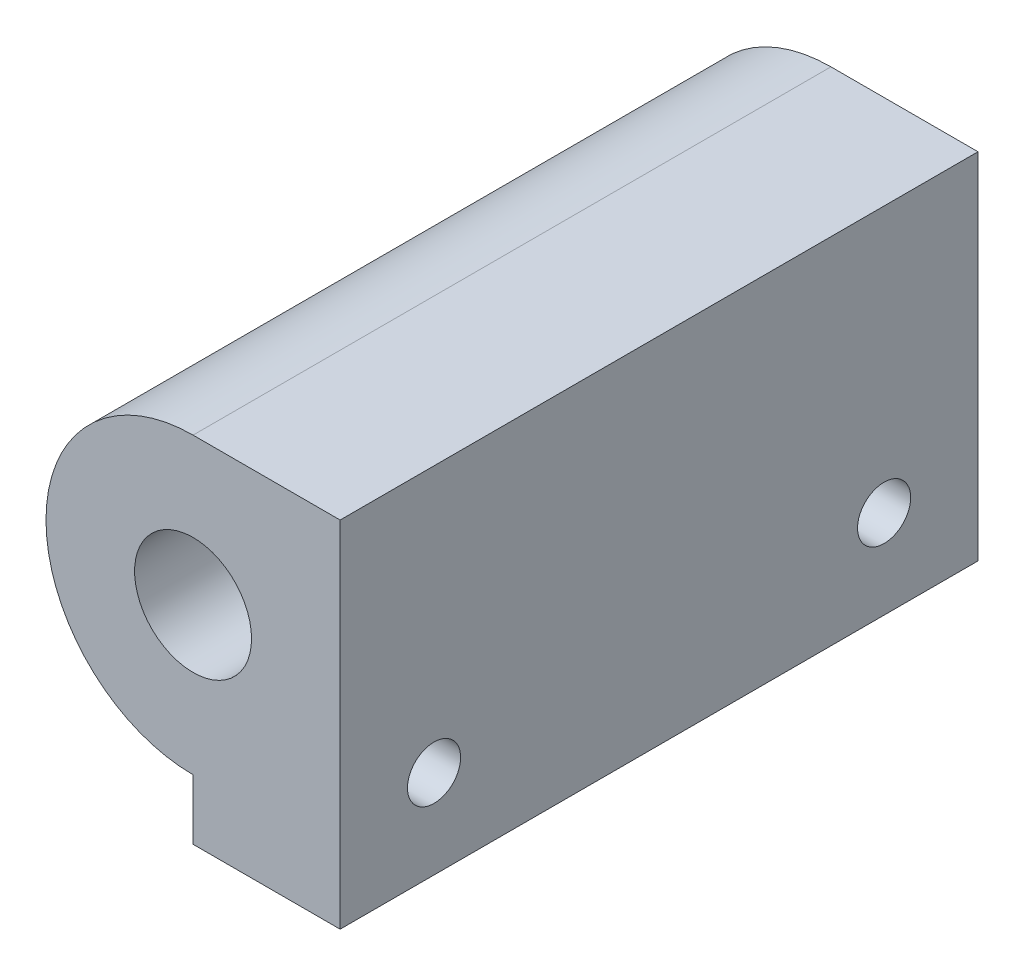
ISO-10303-21;
HEADER;
FILE_DESCRIPTION(('STEP AP214'),'2;1');
FILE_NAME('part.step','',(''),(''),'','','');
FILE_SCHEMA(('AUTOMOTIVE_DESIGN { 1 0 10303 214 1 1 1 1 }'));
ENDSEC;
DATA;
#1=APPLICATION_CONTEXT('core data for automotive mechanical design processes');
#2=APPLICATION_PROTOCOL_DEFINITION('international standard','automotive_design',2000,#1);
#3=PRODUCT_CONTEXT('',#1,'mechanical');
#4=PRODUCT('Part','Part','',(#3));
#5=PRODUCT_RELATED_PRODUCT_CATEGORY('part','',(#4));
#6=PRODUCT_DEFINITION_FORMATION('','',#4);
#7=PRODUCT_DEFINITION_CONTEXT('part definition',#1,'design');
#8=PRODUCT_DEFINITION('design','',#6,#7);
#9=PRODUCT_DEFINITION_SHAPE('','',#8);
#10=(LENGTH_UNIT() NAMED_UNIT(*) SI_UNIT(.MILLI.,.METRE.));
#11=(NAMED_UNIT(*) PLANE_ANGLE_UNIT() SI_UNIT($,.RADIAN.));
#12=(NAMED_UNIT(*) SI_UNIT($,.STERADIAN.) SOLID_ANGLE_UNIT());
#13=UNCERTAINTY_MEASURE_WITH_UNIT(LENGTH_MEASURE(1.E-05),#10,'distance_accuracy_value','');
#14=(GEOMETRIC_REPRESENTATION_CONTEXT(3) GLOBAL_UNCERTAINTY_ASSIGNED_CONTEXT((#13)) GLOBAL_UNIT_ASSIGNED_CONTEXT((#10,
#11,#12)) REPRESENTATION_CONTEXT('',''));
#15=CARTESIAN_POINT('',(0.,0.,0.));
#16=DIRECTION('',(0.,0.,1.));
#17=DIRECTION('',(1.,0.,0.));
#18=AXIS2_PLACEMENT_3D('',#15,#16,#17);
#19=CARTESIAN_POINT('',(0.,0.,9.));
#20=DIRECTION('',(0.,0.,1.));
#21=DIRECTION('',(1.,0.,0.));
#22=AXIS2_PLACEMENT_3D('',#19,#20,#21);
#23=PLANE('',#22);
#24=CARTESIAN_POINT('',(0.,0.,9.));
#25=DIRECTION('',(0.,0.,1.));
#26=DIRECTION('',(1.,0.,0.));
#27=AXIS2_PLACEMENT_3D('',#24,#25,#26);
#28=CIRCLE('',#27,4.15);
#29=CARTESIAN_POINT('',(0.,4.15,9.));
#30=VERTEX_POINT('',#29);
#31=CARTESIAN_POINT('',(0.,-4.15,9.));
#32=VERTEX_POINT('',#31);
#33=EDGE_CURVE('E118',#30,#32,#28,.T.);
#34=ORIENTED_EDGE('',*,*,#33,.T.);
#35=DIRECTION('',(0.,-1.,0.));
#36=VECTOR('',#35,1.);
#37=CARTESIAN_POINT('',(0.,-4.15,9.));
#38=LINE('',#37,#36);
#39=CARTESIAN_POINT('',(0.,-5.85,9.));
#40=VERTEX_POINT('',#39);
#41=EDGE_CURVE('E85',#32,#40,#38,.T.);
#42=ORIENTED_EDGE('',*,*,#41,.T.);
#43=DIRECTION('',(1.,0.,0.));
#44=VECTOR('',#43,1.);
#45=CARTESIAN_POINT('',(0.,-5.85,9.));
#46=LINE('',#45,#44);
#47=CARTESIAN_POINT('',(4.15,-5.85,9.));
#48=VERTEX_POINT('',#47);
#49=EDGE_CURVE('E89',#40,#48,#46,.T.);
#50=ORIENTED_EDGE('',*,*,#49,.T.);
#51=DIRECTION('',(0.,1.,0.));
#52=VECTOR('',#51,1.);
#53=CARTESIAN_POINT('',(4.15,-5.85,9.));
#54=LINE('',#53,#52);
#55=CARTESIAN_POINT('',(4.15,4.15,9.));
#56=VERTEX_POINT('',#55);
#57=EDGE_CURVE('E93',#48,#56,#54,.T.);
#58=ORIENTED_EDGE('',*,*,#57,.T.);
#59=DIRECTION('',(-1.,0.,0.));
#60=VECTOR('',#59,1.);
#61=CARTESIAN_POINT('',(4.15,4.15,9.));
#62=LINE('',#61,#60);
#63=EDGE_CURVE('E51',#56,#30,#62,.T.);
#64=ORIENTED_EDGE('',*,*,#63,.T.);
#65=EDGE_LOOP('',(#34,#42,#50,#58,#64));
#66=FACE_BOUND('',#65,.T.);
#67=CARTESIAN_POINT('',(0.,0.,9.));
#68=DIRECTION('',(0.,0.,1.));
#69=DIRECTION('',(1.,0.,0.));
#70=AXIS2_PLACEMENT_3D('',#67,#68,#69);
#71=CIRCLE('',#70,1.65);
#72=CARTESIAN_POINT('',(1.65,0.,9.));
#73=VERTEX_POINT('',#72);
#74=EDGE_CURVE('E113',#73,#73,#71,.T.);
#75=ORIENTED_EDGE('',*,*,#74,.F.);
#76=EDGE_LOOP('',(#75));
#77=FACE_BOUND('',#76,.T.);
#78=ADVANCED_FACE('F33',(#66,#77),#23,.T.);
#79=CARTESIAN_POINT('',(0.,0.,-9.));
#80=DIRECTION('',(0.,0.,1.));
#81=DIRECTION('',(1.,0.,0.));
#82=AXIS2_PLACEMENT_3D('',#79,#80,#81);
#83=PLANE('',#82);
#84=CARTESIAN_POINT('',(0.,0.,-9.));
#85=DIRECTION('',(0.,0.,1.));
#86=DIRECTION('',(1.,0.,0.));
#87=AXIS2_PLACEMENT_3D('',#84,#85,#86);
#88=CIRCLE('',#87,4.15);
#89=CARTESIAN_POINT('',(0.,4.15,-9.));
#90=VERTEX_POINT('',#89);
#91=CARTESIAN_POINT('',(0.,-4.15,-9.));
#92=VERTEX_POINT('',#91);
#93=EDGE_CURVE('E109',#90,#92,#88,.T.);
#94=ORIENTED_EDGE('',*,*,#93,.F.);
#95=DIRECTION('',(-1.,0.,0.));
#96=VECTOR('',#95,1.);
#97=CARTESIAN_POINT('',(4.15,4.15,-9.));
#98=LINE('',#97,#96);
#99=CARTESIAN_POINT('',(4.15,4.15,-9.));
#100=VERTEX_POINT('',#99);
#101=EDGE_CURVE('E77',#100,#90,#98,.T.);
#102=ORIENTED_EDGE('',*,*,#101,.F.);
#103=DIRECTION('',(0.,1.,0.));
#104=VECTOR('',#103,1.);
#105=CARTESIAN_POINT('',(4.15,-5.85,-9.));
#106=LINE('',#105,#104);
#107=CARTESIAN_POINT('',(4.15,-5.85,-9.));
#108=VERTEX_POINT('',#107);
#109=EDGE_CURVE('E71',#108,#100,#106,.T.);
#110=ORIENTED_EDGE('',*,*,#109,.F.);
#111=DIRECTION('',(1.,0.,0.));
#112=VECTOR('',#111,1.);
#113=CARTESIAN_POINT('',(0.,-5.85,-9.));
#114=LINE('',#113,#112);
#115=CARTESIAN_POINT('',(0.,-5.85,-9.));
#116=VERTEX_POINT('',#115);
#117=EDGE_CURVE('E100',#116,#108,#114,.T.);
#118=ORIENTED_EDGE('',*,*,#117,.F.);
#119=DIRECTION('',(0.,-1.,0.));
#120=VECTOR('',#119,1.);
#121=CARTESIAN_POINT('',(0.,-4.15,-9.));
#122=LINE('',#121,#120);
#123=EDGE_CURVE('E112',#92,#116,#122,.T.);
#124=ORIENTED_EDGE('',*,*,#123,.F.);
#125=EDGE_LOOP('',(#94,#102,#110,#118,#124));
#126=FACE_BOUND('',#125,.T.);
#127=CARTESIAN_POINT('',(0.,0.,-9.));
#128=DIRECTION('',(0.,0.,1.));
#129=DIRECTION('',(1.,0.,0.));
#130=AXIS2_PLACEMENT_3D('',#127,#128,#129);
#131=CIRCLE('',#130,1.65);
#132=CARTESIAN_POINT('',(1.65,0.,-9.));
#133=VERTEX_POINT('',#132);
#134=EDGE_CURVE('E170',#133,#133,#131,.T.);
#135=ORIENTED_EDGE('',*,*,#134,.T.);
#136=EDGE_LOOP('',(#135));
#137=FACE_BOUND('',#136,.T.);
#138=ADVANCED_FACE('F122',(#126,#137),#83,.F.);
#139=CARTESIAN_POINT('',(0.,0.,9.));
#140=DIRECTION('',(0.,0.,-1.));
#141=DIRECTION('',(-1.,0.,0.));
#142=AXIS2_PLACEMENT_3D('',#139,#140,#141);
#143=CYLINDRICAL_SURFACE('',#142,4.15);
#144=CARTESIAN_POINT('',(-2.44948974278318,-3.35,5.6));
#145=CARTESIAN_POINT('',(-2.52343122206385,-3.29593660031395,5.59999746942867));
#146=CARTESIAN_POINT('',(-2.59560716615755,-3.23938834132045,5.60578919743885));
#147=CARTESIAN_POINT('',(-2.73435232068845,-3.12312159664327,5.63267031478044));
#148=CARTESIAN_POINT('',(-2.80094287987506,-3.06341675186005,5.65369818695591));
#149=CARTESIAN_POINT('',(-2.89713692579164,-2.97175793802122,5.70133751223552));
#150=CARTESIAN_POINT('',(-2.92983277227072,-2.93948231337421,5.72110681452365));
#151=CARTESIAN_POINT('',(-2.99184367546275,-2.87633646676008,5.76719042637763));
#152=CARTESIAN_POINT('',(-3.02116212605836,-2.84546485315111,5.793498080212));
#153=CARTESIAN_POINT('',(-3.07103947041873,-2.79147748861172,5.84822284743359));
#154=CARTESIAN_POINT('',(-3.09224764874424,-2.76791647439239,5.8756031388966));
#155=CARTESIAN_POINT('',(-3.13095268703524,-2.72405745001184,5.9351989023861));
#156=CARTESIAN_POINT('',(-3.14845322757933,-2.70375620876228,5.96740952455513));
#157=CARTESIAN_POINT('',(-3.17675223705296,-2.67042162645601,6.03099972984364));
#158=CARTESIAN_POINT('',(-3.18816329973604,-2.65675403386292,6.06177279876657));
#159=CARTESIAN_POINT('',(-3.20743019158531,-2.63346183084668,6.12587117920833));
#160=CARTESIAN_POINT('',(-3.21528730931639,-2.62383575516915,6.1591955605575));
#161=CARTESIAN_POINT('',(-3.227163283603,-2.60921597139552,6.22765467063681));
#162=CARTESIAN_POINT('',(-3.23116733002771,-2.60424013963282,6.26279584190567));
#163=CARTESIAN_POINT('',(-3.23511226915684,-2.59933826063692,6.333655154036));
#164=CARTESIAN_POINT('',(-3.23505394643214,-2.59941123832024,6.36937318215612));
#165=CARTESIAN_POINT('',(-3.23102464807214,-2.60441695856549,6.43775144198534));
#166=CARTESIAN_POINT('',(-3.22732284379696,-2.60901537056492,6.47045312057464));
#167=CARTESIAN_POINT('',(-3.21654122773918,-2.62229572999499,6.53442868712956));
#168=CARTESIAN_POINT('',(-3.20946153060368,-2.63097753883326,6.56570262351388));
#169=CARTESIAN_POINT('',(-3.19198210771253,-2.6521578335778,6.62673530787836));
#170=CARTESIAN_POINT('',(-3.18151471650196,-2.66473385951379,6.65644744184263));
#171=CARTESIAN_POINT('',(-3.15764317093928,-2.69297808491294,6.71307684956784));
#172=CARTESIAN_POINT('',(-3.14423810139289,-2.70864724785017,6.73999324849471));
#173=CARTESIAN_POINT('',(-3.11314161599893,-2.74435240723745,6.79367496457873));
#174=CARTESIAN_POINT('',(-3.09513290942465,-2.76468439284931,6.82005809044302));
#175=CARTESIAN_POINT('',(-3.05641052520705,-2.80743489668986,6.86882264332002));
#176=CARTESIAN_POINT('',(-3.03569518767351,-2.82985469286221,6.89120159458094));
#177=CARTESIAN_POINT('',(-2.97994319463473,-2.88874549564683,6.94332165897411));
#178=CARTESIAN_POINT('',(-2.94330962289143,-2.92614586932086,6.97031502685646));
#179=CARTESIAN_POINT('',(-2.86599398366922,-3.00192225881424,7.01581141626264));
#180=CARTESIAN_POINT('',(-2.82530212818757,-3.04030045868933,7.03429327582207));
#181=CARTESIAN_POINT('',(-2.72128194633168,-3.13433177975411,7.07082390239127));
#182=CARTESIAN_POINT('',(-2.65623722024531,-3.18970614192668,7.08466235286137));
#183=CARTESIAN_POINT('',(-2.5220023254017,-3.29688274198948,7.10007860534017));
#184=CARTESIAN_POINT('',(-2.45280641609834,-3.3486798097651,7.10163901536407));
#185=CARTESIAN_POINT('',(-2.32674851018242,-3.43705440573849,7.09594707241719));
#186=CARTESIAN_POINT('',(-2.27040500660959,-3.47452120875493,7.09050401783873));
#187=CARTESIAN_POINT('',(-2.15642251759147,-3.54639027571075,7.07476586221194));
#188=CARTESIAN_POINT('',(-2.09878274846423,-3.58079061979699,7.06446774651982));
#189=CARTESIAN_POINT('',(-1.98239938567192,-3.64651540961997,7.03979304204072));
#190=CARTESIAN_POINT('',(-1.92365287689895,-3.67782978047239,7.02540365405214));
#191=CARTESIAN_POINT('',(-1.80551612262155,-3.73724261117717,6.99318326983734));
#192=CARTESIAN_POINT('',(-1.74612607227611,-3.76534201767794,6.97535329087132));
#193=CARTESIAN_POINT('',(-1.62321684381895,-3.82000863713052,6.93549700833041));
#194=CARTESIAN_POINT('',(-1.55966983307058,-3.84637302933308,6.91327914605763));
#195=CARTESIAN_POINT('',(-1.43233121804341,-3.89558600652535,6.86575809507171));
#196=CARTESIAN_POINT('',(-1.36853949730666,-3.91843262636162,6.84045319587362));
#197=CARTESIAN_POINT('',(-1.2413771668916,-3.96054796605189,6.78691120707431));
#198=CARTESIAN_POINT('',(-1.17800598770701,-3.97983300782711,6.75868846762551));
#199=CARTESIAN_POINT('',(-1.08356985364423,-4.00617597929975,6.71363850545306));
#200=CARTESIAN_POINT('',(-1.05220691357545,-4.01452340196624,6.69817588833988));
#201=CARTESIAN_POINT('',(-0.989838975030945,-4.0303537625373,6.66613233635059));
#202=CARTESIAN_POINT('',(-0.958833880757644,-4.03783693687625,6.64955170930633));
#203=CARTESIAN_POINT('',(-0.906789383208169,-4.0497795478508,6.62014403972917));
#204=CARTESIAN_POINT('',(-0.885582593118669,-4.05446718219123,6.60770595497569));
#205=CARTESIAN_POINT('',(-0.84361346326138,-4.06340698498532,6.58181712998326));
#206=CARTESIAN_POINT('',(-0.822852361613754,-4.06765804010296,6.56836394542793));
#207=CARTESIAN_POINT('',(-0.782330855757109,-4.07564514972176,6.54014052702323));
#208=CARTESIAN_POINT('',(-0.762565270926685,-4.07938409425555,6.52537853050875));
#209=CARTESIAN_POINT('',(-0.724703240842739,-4.08627769550915,6.49373818525069));
#210=CARTESIAN_POINT('',(-0.706599030164215,-4.08943514819407,6.47687065495114));
#211=CARTESIAN_POINT('',(-0.684710480315217,-4.09312932324512,6.45150361848125));
#212=CARTESIAN_POINT('',(-0.679194003215416,-4.09404727604132,6.44458301064337));
#213=CARTESIAN_POINT('',(-0.668914467388147,-4.09573926272273,6.43016271849298));
#214=CARTESIAN_POINT('',(-0.664152286767495,-4.09651312905228,6.42266237417557));
#215=CARTESIAN_POINT('',(-0.655665842445884,-4.0978800829948,6.40690976272135));
#216=CARTESIAN_POINT('',(-0.651958731924025,-4.09847019620049,6.39864767723771));
#217=CARTESIAN_POINT('',(-0.646189448659516,-4.09938387061317,6.38155956669553));
#218=CARTESIAN_POINT('',(-0.644120609390134,-4.09970851226697,6.3727359866499));
#219=CARTESIAN_POINT('',(-0.642281521760349,-4.09999695098521,6.35706899291204));
#220=CARTESIAN_POINT('',(-0.64206769397036,-4.10003039178843,6.35027863966541));
#221=CARTESIAN_POINT('',(-0.642812869114294,-4.09991362894346,6.33676239893693));
#222=CARTESIAN_POINT('',(-0.64377252153388,-4.09976332359736,6.33003654923304));
#223=CARTESIAN_POINT('',(-0.647094318840628,-4.09924044978622,6.31528141735955));
#224=CARTESIAN_POINT('',(-0.649733014502407,-4.09882395618041,6.30731718913561));
#225=CARTESIAN_POINT('',(-0.656235341420141,-4.09778794469016,6.29192160946295));
#226=CARTESIAN_POINT('',(-0.660101929629371,-4.09716793658916,6.28449159801881));
#227=CARTESIAN_POINT('',(-0.672010695081479,-4.09523623665373,6.26463954957736));
#228=CARTESIAN_POINT('',(-0.680970999380265,-4.09376022835878,6.2527954566248));
#229=CARTESIAN_POINT('',(-0.70034090254565,-4.0904915667484,6.23041753516032));
#230=CARTESIAN_POINT('',(-0.710755776425359,-4.08869775425148,6.21988875245664));
#231=CARTESIAN_POINT('',(-0.74109001549379,-4.0833410325798,6.19171658307992));
#232=CARTESIAN_POINT('',(-0.761935612795578,-4.07951270766768,6.17513602031386));
#233=CARTESIAN_POINT('',(-0.804839931554315,-4.07126728143743,6.14376372543542));
#234=CARTESIAN_POINT('',(-0.826901847096343,-4.0668485818521,6.1289770647735));
#235=CARTESIAN_POINT('',(-0.871816129241676,-4.0574579883218,6.10054360536219));
#236=CARTESIAN_POINT('',(-0.894672307855853,-4.05248306302808,6.08690384077216));
#237=CARTESIAN_POINT('',(-0.940747820345933,-4.0420356348797,6.06054063856686));
#238=CARTESIAN_POINT('',(-0.963966653563796,-4.03656377510435,6.04781605380491));
#239=CARTESIAN_POINT('',(-1.02578735991133,-4.02142109530244,6.01503683396525));
#240=CARTESIAN_POINT('',(-1.06460274875312,-4.01132799083689,5.99557855252238));
#241=CARTESIAN_POINT('',(-1.14256180520273,-3.98982346590886,5.95809384836561));
#242=CARTESIAN_POINT('',(-1.18170556404535,-3.97841166699452,5.94006783921662));
#243=CARTESIAN_POINT('',(-1.29945721668832,-3.9421638275787,5.88777754375848));
#244=CARTESIAN_POINT('',(-1.37828517479198,-3.91533964330071,5.85535217120073));
#245=CARTESIAN_POINT('',(-1.53539811091308,-3.85643298159655,5.79521773686373));
#246=CARTESIAN_POINT('',(-1.61368402089443,-3.82437000762717,5.76749193087935));
#247=CARTESIAN_POINT('',(-1.76942183033298,-3.75485124612192,5.71720152784886));
#248=CARTESIAN_POINT('',(-1.84687455964081,-3.71740148870781,5.69463123173422));
#249=CARTESIAN_POINT('',(-2.01380938087046,-3.63007042834357,5.65228310144667));
#250=CARTESIAN_POINT('',(-2.10305754277822,-3.57915919385294,5.63366166227553));
#251=CARTESIAN_POINT('',(-2.27879754480828,-3.46990783456236,5.60751956575151));
#252=CARTESIAN_POINT('',(-2.36528838753084,-3.41156505884654,5.60000288170507));
#253=CARTESIAN_POINT('',(-2.44948974278318,-3.35,5.6));
#254=B_SPLINE_CURVE_WITH_KNOTS('',3,(#144,#145,#146,#147,#148,#149,#150,#151,#152,#153,#154,
#155,#156,#157,#158,#159,#160,#161,#162,#163,#164,#165,#166,#167,#168,#169,#170,#171,#172,#173,
#174,#175,#176,#177,#178,#179,#180,#181,#182,#183,#184,#185,#186,#187,#188,#189,#190,#191,#192,
#193,#194,#195,#196,#197,#198,#199,#200,#201,#202,#203,#204,#205,#206,#207,#208,#209,#210,#211,
#212,#213,#214,#215,#216,#217,#218,#219,#220,#221,#222,#223,#224,#225,#226,#227,#228,#229,#230,
#231,#232,#233,#234,#235,#236,#237,#238,#239,#240,#241,#242,#243,#244,#245,#246,#247,#248,#249,
#250,#251,#252,#253),.UNSPECIFIED.,.T.,.F.,(4,2,2,2,2,2,2,2,2,2,2,2,2,2,2,2,2,2,2,2,2,2,2,2,2,2,
2,2,2,2,2,2,2,2,2,2,2,2,2,2,2,2,2,2,2,2,2,2,2,2,2,2,2,2,4),(0.,0.274556543716564,
0.548010677031381,0.697615842351792,0.847069336038143,0.972245776227143,1.09729736517205,
1.20350040101851,1.3096648995725,1.41623585388968,1.52278622607009,1.6220139559011,
1.72123831814069,1.82258144699132,1.92395619293095,2.03712963481843,2.150372811017,
2.32607854888931,2.50221881222103,2.76039103475375,3.01892889547571,3.22230381620315,
3.42580518478555,3.62995033059442,3.83403521018231,4.05076564664347,4.26761672060589,
4.48344791921148,4.59127790711428,4.69907832549394,4.77414608879031,4.84940076462727,
4.92421151749257,4.99865259220138,5.02530820489699,5.05199462394208,5.07909291167778,
5.10608035492782,5.12635854868768,5.1466479708937,5.17170459380891,5.19682202041155,
5.24134412256051,5.28603209274775,5.36654417697053,5.44727881594985,5.52847712863427,
5.60957182108953,5.74324349937861,5.87695363580185,6.14471849338705,6.41150830097412,
6.67800174756909,6.99054305149673,7.30319615634713),.UNSPECIFIED.);
#255=CARTESIAN_POINT('',(-2.44948974278318,-3.35,5.6));
#256=VERTEX_POINT('',#255);
#257=EDGE_CURVE('E161',#256,#256,#254,.T.);
#258=ORIENTED_EDGE('',*,*,#257,.T.);
#259=EDGE_LOOP('',(#258));
#260=FACE_BOUND('',#259,.T.);
#261=CARTESIAN_POINT('',(-2.44948974278318,-3.35,-7.1));
#262=CARTESIAN_POINT('',(-2.52343122206385,-3.29593660031395,-7.10000253057133));
#263=CARTESIAN_POINT('',(-2.59560716615755,-3.23938834132045,-7.09421080256115));
#264=CARTESIAN_POINT('',(-2.73435232068845,-3.12312159664327,-7.06732968521956));
#265=CARTESIAN_POINT('',(-2.80094287987506,-3.06341675186005,-7.04630181304409));
#266=CARTESIAN_POINT('',(-2.89713692579164,-2.97175793802122,-6.99866248776448));
#267=CARTESIAN_POINT('',(-2.92983277227072,-2.93948231337421,-6.97889318547635));
#268=CARTESIAN_POINT('',(-2.99184367546275,-2.87633646676008,-6.93280957362238));
#269=CARTESIAN_POINT('',(-3.02116212605836,-2.84546485315111,-6.906501919788));
#270=CARTESIAN_POINT('',(-3.07103947041873,-2.79147748861172,-6.85177715256641));
#271=CARTESIAN_POINT('',(-3.09224764874424,-2.76791647439239,-6.8243968611034));
#272=CARTESIAN_POINT('',(-3.13095268703524,-2.72405745001184,-6.7648010976139));
#273=CARTESIAN_POINT('',(-3.14845322757933,-2.70375620876228,-6.73259047544487));
#274=CARTESIAN_POINT('',(-3.17675223705296,-2.67042162645601,-6.66900027015636));
#275=CARTESIAN_POINT('',(-3.18816329973604,-2.65675403386292,-6.63822720123343));
#276=CARTESIAN_POINT('',(-3.20743019158531,-2.63346183084668,-6.57412882079167));
#277=CARTESIAN_POINT('',(-3.21528730931639,-2.62383575516915,-6.5408044394425));
#278=CARTESIAN_POINT('',(-3.227163283603,-2.60921597139552,-6.47234532936319));
#279=CARTESIAN_POINT('',(-3.23116733002771,-2.60424013963282,-6.43720415809433));
#280=CARTESIAN_POINT('',(-3.23511226915684,-2.59933826063692,-6.36634484596399));
#281=CARTESIAN_POINT('',(-3.23505394643214,-2.59941123832024,-6.33062681784388));
#282=CARTESIAN_POINT('',(-3.23102464807214,-2.60441695856549,-6.26224855801466));
#283=CARTESIAN_POINT('',(-3.22732284379696,-2.60901537056492,-6.22954687942536));
#284=CARTESIAN_POINT('',(-3.21654122773918,-2.62229572999499,-6.16557131287045));
#285=CARTESIAN_POINT('',(-3.20946153060368,-2.63097753883326,-6.13429737648612));
#286=CARTESIAN_POINT('',(-3.19198210771253,-2.6521578335778,-6.07326469212164));
#287=CARTESIAN_POINT('',(-3.18151471650196,-2.66473385951379,-6.04355255815737));
#288=CARTESIAN_POINT('',(-3.15764317093928,-2.69297808491294,-5.98692315043216));
#289=CARTESIAN_POINT('',(-3.14423810139289,-2.70864724785017,-5.96000675150529));
#290=CARTESIAN_POINT('',(-3.11314161599893,-2.74435240723745,-5.90632503542127));
#291=CARTESIAN_POINT('',(-3.09513290942465,-2.76468439284931,-5.87994190955698));
#292=CARTESIAN_POINT('',(-3.05641052520705,-2.80743489668986,-5.83117735667998));
#293=CARTESIAN_POINT('',(-3.03569518767351,-2.82985469286221,-5.80879840541906));
#294=CARTESIAN_POINT('',(-2.97994319463473,-2.88874549564683,-5.75667834102589));
#295=CARTESIAN_POINT('',(-2.94330962289143,-2.92614586932086,-5.72968497314354));
#296=CARTESIAN_POINT('',(-2.86599398366922,-3.00192225881424,-5.68418858373736));
#297=CARTESIAN_POINT('',(-2.82530212818757,-3.04030045868933,-5.66570672417793));
#298=CARTESIAN_POINT('',(-2.72128194633168,-3.13433177975411,-5.62917609760873));
#299=CARTESIAN_POINT('',(-2.65623722024531,-3.18970614192668,-5.61533764713863));
#300=CARTESIAN_POINT('',(-2.5220023254017,-3.29688274198948,-5.59992139465983));
#301=CARTESIAN_POINT('',(-2.45280641609834,-3.3486798097651,-5.59836098463593));
#302=CARTESIAN_POINT('',(-2.32674851018242,-3.43705440573849,-5.60405292758281));
#303=CARTESIAN_POINT('',(-2.27040500660959,-3.47452120875493,-5.60949598216127));
#304=CARTESIAN_POINT('',(-2.15642251759147,-3.54639027571075,-5.62523413778806));
#305=CARTESIAN_POINT('',(-2.09878274846423,-3.58079061979699,-5.63553225348018));
#306=CARTESIAN_POINT('',(-1.98239938567192,-3.64651540961997,-5.66020695795928));
#307=CARTESIAN_POINT('',(-1.92365287689895,-3.67782978047239,-5.67459634594786));
#308=CARTESIAN_POINT('',(-1.80551612262155,-3.73724261117717,-5.70681673016265));
#309=CARTESIAN_POINT('',(-1.74612607227611,-3.76534201767794,-5.72464670912867));
#310=CARTESIAN_POINT('',(-1.62321684381895,-3.82000863713052,-5.76450299166959));
#311=CARTESIAN_POINT('',(-1.55966983307058,-3.84637302933308,-5.78672085394237));
#312=CARTESIAN_POINT('',(-1.43233121804341,-3.89558600652535,-5.83424190492829));
#313=CARTESIAN_POINT('',(-1.36853949730666,-3.91843262636162,-5.85954680412638));
#314=CARTESIAN_POINT('',(-1.2413771668916,-3.96054796605189,-5.91308879292569));
#315=CARTESIAN_POINT('',(-1.17800598770701,-3.97983300782711,-5.94131153237449));
#316=CARTESIAN_POINT('',(-1.08356985364422,-4.00617597929975,-5.98636149454694));
#317=CARTESIAN_POINT('',(-1.05220691357545,-4.01452340196624,-6.00182411166012));
#318=CARTESIAN_POINT('',(-0.989838975030945,-4.0303537625373,-6.03386766364941));
#319=CARTESIAN_POINT('',(-0.958833880757643,-4.03783693687625,-6.05044829069367));
#320=CARTESIAN_POINT('',(-0.906789383208169,-4.0497795478508,-6.07985596027083));
#321=CARTESIAN_POINT('',(-0.885582593118669,-4.05446718219123,-6.09229404502431));
#322=CARTESIAN_POINT('',(-0.84361346326138,-4.06340698498532,-6.11818287001674));
#323=CARTESIAN_POINT('',(-0.822852361613754,-4.06765804010296,-6.13163605457207));
#324=CARTESIAN_POINT('',(-0.782330855757109,-4.07564514972176,-6.15985947297677));
#325=CARTESIAN_POINT('',(-0.762565270926685,-4.07938409425555,-6.17462146949125));
#326=CARTESIAN_POINT('',(-0.724703240842739,-4.08627769550915,-6.20626181474931));
#327=CARTESIAN_POINT('',(-0.706599030164215,-4.08943514819407,-6.22312934504886));
#328=CARTESIAN_POINT('',(-0.684710480315217,-4.09312932324512,-6.24849638151875));
#329=CARTESIAN_POINT('',(-0.679194003215416,-4.09404727604132,-6.25541698935663));
#330=CARTESIAN_POINT('',(-0.668914467388147,-4.09573926272273,-6.26983728150702));
#331=CARTESIAN_POINT('',(-0.664152286767495,-4.09651312905228,-6.27733762582443));
#332=CARTESIAN_POINT('',(-0.655665842445884,-4.0978800829948,-6.29309023727865));
#333=CARTESIAN_POINT('',(-0.651958731924025,-4.09847019620049,-6.30135232276229));
#334=CARTESIAN_POINT('',(-0.646189448659515,-4.09938387061317,-6.31844043330447));
#335=CARTESIAN_POINT('',(-0.644120609390134,-4.09970851226697,-6.3272640133501));
#336=CARTESIAN_POINT('',(-0.642281521760349,-4.09999695098521,-6.34293100708796));
#337=CARTESIAN_POINT('',(-0.64206769397036,-4.10003039178843,-6.34972136033459));
#338=CARTESIAN_POINT('',(-0.642812869114294,-4.09991362894346,-6.36323760106307));
#339=CARTESIAN_POINT('',(-0.64377252153388,-4.09976332359736,-6.36996345076696));
#340=CARTESIAN_POINT('',(-0.647094318840628,-4.09924044978622,-6.38471858264045));
#341=CARTESIAN_POINT('',(-0.649733014502407,-4.09882395618041,-6.39268281086439));
#342=CARTESIAN_POINT('',(-0.656235341420141,-4.09778794469016,-6.40807839053705));
#343=CARTESIAN_POINT('',(-0.660101929629371,-4.09716793658916,-6.41550840198119));
#344=CARTESIAN_POINT('',(-0.672010695081479,-4.09523623665373,-6.43536045042263));
#345=CARTESIAN_POINT('',(-0.680970999380265,-4.09376022835878,-6.4472045433752));
#346=CARTESIAN_POINT('',(-0.70034090254565,-4.0904915667484,-6.46958246483968));
#347=CARTESIAN_POINT('',(-0.710755776425359,-4.08869775425148,-6.48011124754336));
#348=CARTESIAN_POINT('',(-0.74109001549379,-4.0833410325798,-6.50828341692008));
#349=CARTESIAN_POINT('',(-0.761935612795578,-4.07951270766768,-6.52486397968614));
#350=CARTESIAN_POINT('',(-0.804839931554315,-4.07126728143743,-6.55623627456458));
#351=CARTESIAN_POINT('',(-0.826901847096343,-4.0668485818521,-6.5710229352265));
#352=CARTESIAN_POINT('',(-0.871816129241676,-4.0574579883218,-6.59945639463781));
#353=CARTESIAN_POINT('',(-0.894672307855853,-4.05248306302808,-6.61309615922784));
#354=CARTESIAN_POINT('',(-0.940747820345933,-4.0420356348797,-6.63945936143314));
#355=CARTESIAN_POINT('',(-0.963966653563796,-4.03656377510435,-6.65218394619509));
#356=CARTESIAN_POINT('',(-1.02578735991133,-4.02142109530244,-6.68496316603475));
#357=CARTESIAN_POINT('',(-1.06460274875312,-4.01132799083689,-6.70442144747762));
#358=CARTESIAN_POINT('',(-1.14256180520273,-3.98982346590886,-6.74190615163438));
#359=CARTESIAN_POINT('',(-1.18170556404535,-3.97841166699452,-6.75993216078338));
#360=CARTESIAN_POINT('',(-1.29945721668832,-3.9421638275787,-6.81222245624152));
#361=CARTESIAN_POINT('',(-1.37828517479198,-3.91533964330071,-6.84464782879927));
#362=CARTESIAN_POINT('',(-1.53539811091308,-3.85643298159655,-6.90478226313627));
#363=CARTESIAN_POINT('',(-1.61368402089443,-3.82437000762717,-6.93250806912064));
#364=CARTESIAN_POINT('',(-1.76942183033298,-3.75485124612192,-6.98279847215114));
#365=CARTESIAN_POINT('',(-1.84687455964081,-3.71740148870781,-7.00536876826577));
#366=CARTESIAN_POINT('',(-2.01380938087046,-3.63007042834357,-7.04771689855333));
#367=CARTESIAN_POINT('',(-2.10305754277822,-3.57915919385294,-7.06633833772447));
#368=CARTESIAN_POINT('',(-2.27879754480828,-3.46990783456236,-7.09248043424849));
#369=CARTESIAN_POINT('',(-2.36528838753084,-3.41156505884654,-7.09999711829493));
#370=CARTESIAN_POINT('',(-2.44948974278318,-3.35,-7.1));
#371=B_SPLINE_CURVE_WITH_KNOTS('',3,(#261,#262,#263,#264,#265,#266,#267,#268,#269,#270,#271,
#272,#273,#274,#275,#276,#277,#278,#279,#280,#281,#282,#283,#284,#285,#286,#287,#288,#289,#290,
#291,#292,#293,#294,#295,#296,#297,#298,#299,#300,#301,#302,#303,#304,#305,#306,#307,#308,#309,
#310,#311,#312,#313,#314,#315,#316,#317,#318,#319,#320,#321,#322,#323,#324,#325,#326,#327,#328,
#329,#330,#331,#332,#333,#334,#335,#336,#337,#338,#339,#340,#341,#342,#343,#344,#345,#346,#347,
#348,#349,#350,#351,#352,#353,#354,#355,#356,#357,#358,#359,#360,#361,#362,#363,#364,#365,#366,
#367,#368,#369,#370),.UNSPECIFIED.,.T.,.F.,(4,2,2,2,2,2,2,2,2,2,2,2,2,2,2,2,2,2,2,2,2,2,2,2,2,2,
2,2,2,2,2,2,2,2,2,2,2,2,2,2,2,2,2,2,2,2,2,2,2,2,2,2,2,2,4),(0.,0.274556543716564,
0.548010677031381,0.69761584235179,0.847069336038143,0.972245776227143,1.09729736517205,
1.20350040101851,1.3096648995725,1.41623585388968,1.52278622607009,1.6220139559011,
1.72123831814069,1.82258144699132,1.92395619293095,2.03712963481843,2.150372811017,
2.32607854888931,2.50221881222103,2.76039103475375,3.01892889547571,3.22230381620315,
3.42580518478555,3.62995033059442,3.83403521018231,4.05076564664347,4.26761672060589,
4.48344791921148,4.59127790711428,4.69907832549394,4.77414608879031,4.84940076462727,
4.92421151749257,4.99865259220138,5.02530820489699,5.05199462394208,5.07909291167778,
5.10608035492782,5.12635854868768,5.1466479708937,5.17170459380891,5.19682202041155,
5.24134412256051,5.28603209274775,5.36654417697053,5.44727881594984,5.52847712863426,
5.60957182108953,5.74324349937861,5.87695363580184,6.14471849338705,6.41150830097412,
6.67800174756909,6.99054305149673,7.30319615634713),.UNSPECIFIED.);
#372=CARTESIAN_POINT('',(-2.44948974278318,-3.35,-7.1));
#373=VERTEX_POINT('',#372);
#374=EDGE_CURVE('E154',#373,#373,#371,.T.);
#375=ORIENTED_EDGE('',*,*,#374,.T.);
#376=EDGE_LOOP('',(#375));
#377=FACE_BOUND('',#376,.T.);
#378=ORIENTED_EDGE('',*,*,#93,.T.);
#379=DIRECTION('',(0.,0.,-1.));
#380=VECTOR('',#379,1.);
#381=CARTESIAN_POINT('',(0.,-4.15,9.));
#382=LINE('',#381,#380);
#383=EDGE_CURVE('E11',#32,#92,#382,.T.);
#384=ORIENTED_EDGE('',*,*,#383,.F.);
#385=ORIENTED_EDGE('',*,*,#33,.F.);
#386=DIRECTION('',(0.,0.,-1.));
#387=VECTOR('',#386,1.);
#388=CARTESIAN_POINT('',(0.,4.15,9.));
#389=LINE('',#388,#387);
#390=EDGE_CURVE('E105',#30,#90,#389,.T.);
#391=ORIENTED_EDGE('',*,*,#390,.T.);
#392=EDGE_LOOP('',(#378,#384,#385,#391));
#393=FACE_BOUND('',#392,.T.);
#394=ADVANCED_FACE('F35',(#260,#377,#393),#143,.T.);
#395=CARTESIAN_POINT('',(0.,-4.15,9.));
#396=DIRECTION('',(1.,0.,0.));
#397=DIRECTION('',(0.,0.,-1.));
#398=AXIS2_PLACEMENT_3D('',#395,#396,#397);
#399=PLANE('',#398);
#400=ORIENTED_EDGE('',*,*,#123,.T.);
#401=DIRECTION('',(0.,0.,-1.));
#402=VECTOR('',#401,1.);
#403=CARTESIAN_POINT('',(0.,-5.85,9.));
#404=LINE('',#403,#402);
#405=EDGE_CURVE('E43',#40,#116,#404,.T.);
#406=ORIENTED_EDGE('',*,*,#405,.F.);
#407=ORIENTED_EDGE('',*,*,#41,.F.);
#408=ORIENTED_EDGE('',*,*,#383,.T.);
#409=EDGE_LOOP('',(#400,#406,#407,#408));
#410=FACE_BOUND('',#409,.T.);
#411=ADVANCED_FACE('F194',(#410),#399,.F.);
#412=CARTESIAN_POINT('',(0.,-5.85,9.));
#413=DIRECTION('',(0.,1.,0.));
#414=DIRECTION('',(0.,0.,1.));
#415=AXIS2_PLACEMENT_3D('',#412,#413,#414);
#416=PLANE('',#415);
#417=ORIENTED_EDGE('',*,*,#117,.T.);
#418=DIRECTION('',(0.,0.,-1.));
#419=VECTOR('',#418,1.);
#420=CARTESIAN_POINT('',(4.15,-5.85,9.));
#421=LINE('',#420,#419);
#422=EDGE_CURVE('E97',#48,#108,#421,.T.);
#423=ORIENTED_EDGE('',*,*,#422,.F.);
#424=ORIENTED_EDGE('',*,*,#49,.F.);
#425=ORIENTED_EDGE('',*,*,#405,.T.);
#426=EDGE_LOOP('',(#417,#423,#424,#425));
#427=FACE_BOUND('',#426,.T.);
#428=ADVANCED_FACE('F98',(#427),#416,.F.);
#429=CARTESIAN_POINT('',(4.15,-5.85,9.));
#430=DIRECTION('',(-1.,0.,0.));
#431=DIRECTION('',(0.,0.,1.));
#432=AXIS2_PLACEMENT_3D('',#429,#430,#431);
#433=PLANE('',#432);
#434=CARTESIAN_POINT('',(4.15,-3.35,6.35));
#435=DIRECTION('',(1.,0.,0.));
#436=DIRECTION('',(0.,0.,-1.));
#437=AXIS2_PLACEMENT_3D('',#434,#435,#436);
#438=CIRCLE('',#437,0.75);
#439=CARTESIAN_POINT('',(4.15,-3.35,5.6));
#440=VERTEX_POINT('',#439);
#441=EDGE_CURVE('E162',#440,#440,#438,.T.);
#442=ORIENTED_EDGE('',*,*,#441,.F.);
#443=EDGE_LOOP('',(#442));
#444=FACE_BOUND('',#443,.T.);
#445=CARTESIAN_POINT('',(4.15,-3.35,-6.35));
#446=DIRECTION('',(1.,0.,0.));
#447=DIRECTION('',(0.,0.,-1.));
#448=AXIS2_PLACEMENT_3D('',#445,#446,#447);
#449=CIRCLE('',#448,0.75);
#450=CARTESIAN_POINT('',(4.15,-3.35,-7.1));
#451=VERTEX_POINT('',#450);
#452=EDGE_CURVE('E163',#451,#451,#449,.T.);
#453=ORIENTED_EDGE('',*,*,#452,.F.);
#454=EDGE_LOOP('',(#453));
#455=FACE_BOUND('',#454,.T.);
#456=ORIENTED_EDGE('',*,*,#109,.T.);
#457=DIRECTION('',(0.,0.,-1.));
#458=VECTOR('',#457,1.);
#459=CARTESIAN_POINT('',(4.15,4.15,9.));
#460=LINE('',#459,#458);
#461=EDGE_CURVE('E101',#56,#100,#460,.T.);
#462=ORIENTED_EDGE('',*,*,#461,.F.);
#463=ORIENTED_EDGE('',*,*,#57,.F.);
#464=ORIENTED_EDGE('',*,*,#422,.T.);
#465=EDGE_LOOP('',(#456,#462,#463,#464));
#466=FACE_BOUND('',#465,.T.);
#467=ADVANCED_FACE('F103',(#444,#455,#466),#433,.F.);
#468=CARTESIAN_POINT('',(4.15,4.15,9.));
#469=DIRECTION('',(0.,-1.,0.));
#470=DIRECTION('',(1.,0.,0.));
#471=AXIS2_PLACEMENT_3D('',#468,#469,#470);
#472=PLANE('',#471);
#473=ORIENTED_EDGE('',*,*,#101,.T.);
#474=ORIENTED_EDGE('',*,*,#390,.F.);
#475=ORIENTED_EDGE('',*,*,#63,.F.);
#476=ORIENTED_EDGE('',*,*,#461,.T.);
#477=EDGE_LOOP('',(#473,#474,#475,#476));
#478=FACE_BOUND('',#477,.T.);
#479=ADVANCED_FACE('F127',(#478),#472,.F.);
#480=CARTESIAN_POINT('',(0.,0.,9.));
#481=DIRECTION('',(0.,0.,-1.));
#482=DIRECTION('',(-1.,0.,0.));
#483=AXIS2_PLACEMENT_3D('',#480,#481,#482);
#484=CYLINDRICAL_SURFACE('',#483,1.65);
#485=ORIENTED_EDGE('',*,*,#74,.T.);
#486=EDGE_LOOP('',(#485));
#487=FACE_BOUND('',#486,.T.);
#488=ORIENTED_EDGE('',*,*,#134,.F.);
#489=EDGE_LOOP('',(#488));
#490=FACE_BOUND('',#489,.T.);
#491=ADVANCED_FACE('F129',(#487,#490),#484,.F.);
#492=CARTESIAN_POINT('',(-4.15,-3.35,-6.35));
#493=DIRECTION('',(1.,0.,0.));
#494=DIRECTION('',(0.,0.,-1.));
#495=AXIS2_PLACEMENT_3D('',#492,#493,#494);
#496=CYLINDRICAL_SURFACE('',#495,0.75);
#497=ORIENTED_EDGE('',*,*,#452,.T.);
#498=EDGE_LOOP('',(#497));
#499=FACE_BOUND('',#498,.T.);
#500=ORIENTED_EDGE('',*,*,#374,.F.);
#501=EDGE_LOOP('',(#500));
#502=FACE_BOUND('',#501,.T.);
#503=ADVANCED_FACE('F135',(#499,#502),#496,.F.);
#504=CARTESIAN_POINT('',(-4.15,-3.35,6.35));
#505=DIRECTION('',(1.,0.,0.));
#506=DIRECTION('',(0.,0.,-1.));
#507=AXIS2_PLACEMENT_3D('',#504,#505,#506);
#508=CYLINDRICAL_SURFACE('',#507,0.75);
#509=ORIENTED_EDGE('',*,*,#441,.T.);
#510=EDGE_LOOP('',(#509));
#511=FACE_BOUND('',#510,.T.);
#512=ORIENTED_EDGE('',*,*,#257,.F.);
#513=EDGE_LOOP('',(#512));
#514=FACE_BOUND('',#513,.T.);
#515=ADVANCED_FACE('F150',(#511,#514),#508,.F.);
#516=CLOSED_SHELL('',(#78,#138,#394,#411,#428,#467,#479,#491,#503,#515));
#517=MANIFOLD_SOLID_BREP('B2',#516);
#518=ADVANCED_BREP_SHAPE_REPRESENTATION('',(#18,#517),#14);
#519=SHAPE_DEFINITION_REPRESENTATION(#9,#518);
ENDSEC;
END-ISO-10303-21;
